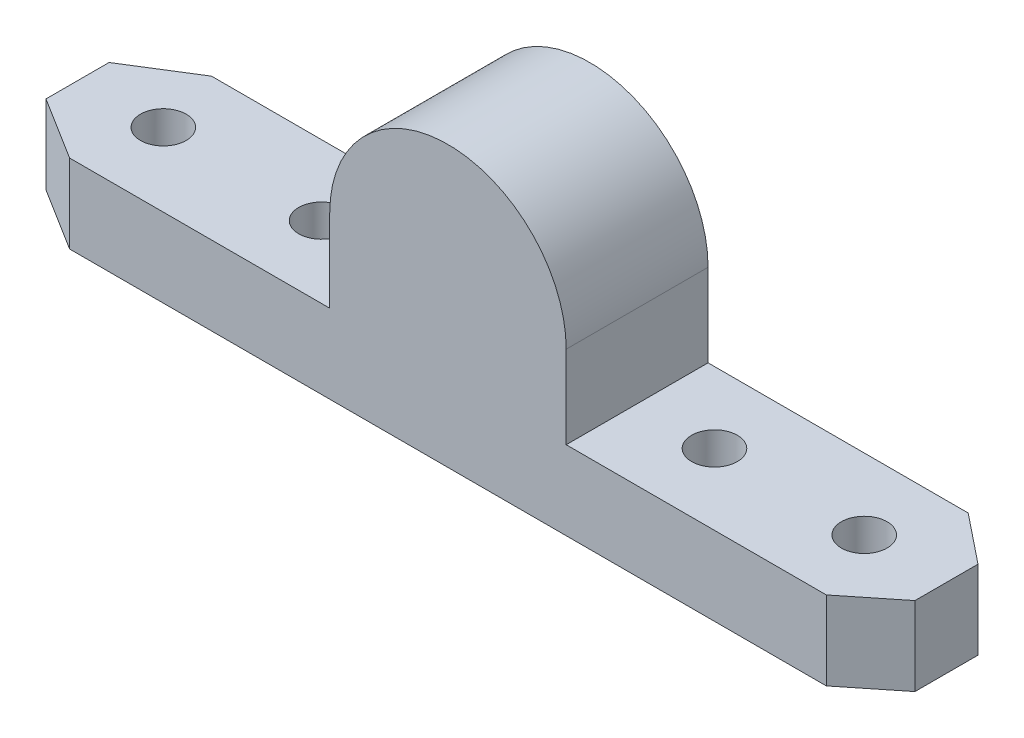
ISO-10303-21;
HEADER;
FILE_DESCRIPTION(('STEP AP214'),'2;1');
FILE_NAME('part.step','',(''),(''),'','','');
FILE_SCHEMA(('AUTOMOTIVE_DESIGN { 1 0 10303 214 1 1 1 1 }'));
ENDSEC;
DATA;
#1=APPLICATION_CONTEXT('core data for automotive mechanical design processes');
#2=APPLICATION_PROTOCOL_DEFINITION('international standard','automotive_design',2000,#1);
#3=PRODUCT_CONTEXT('',#1,'mechanical');
#4=PRODUCT('Part','Part','',(#3));
#5=PRODUCT_RELATED_PRODUCT_CATEGORY('part','',(#4));
#6=PRODUCT_DEFINITION_FORMATION('','',#4);
#7=PRODUCT_DEFINITION_CONTEXT('part definition',#1,'design');
#8=PRODUCT_DEFINITION('design','',#6,#7);
#9=PRODUCT_DEFINITION_SHAPE('','',#8);
#10=(LENGTH_UNIT() NAMED_UNIT(*) SI_UNIT(.MILLI.,.METRE.));
#11=(NAMED_UNIT(*) PLANE_ANGLE_UNIT() SI_UNIT($,.RADIAN.));
#12=(NAMED_UNIT(*) SI_UNIT($,.STERADIAN.) SOLID_ANGLE_UNIT());
#13=UNCERTAINTY_MEASURE_WITH_UNIT(LENGTH_MEASURE(1.E-05),#10,'distance_accuracy_value','');
#14=(GEOMETRIC_REPRESENTATION_CONTEXT(3) GLOBAL_UNCERTAINTY_ASSIGNED_CONTEXT((#13)) GLOBAL_UNIT_ASSIGNED_CONTEXT((#10,
#11,#12)) REPRESENTATION_CONTEXT('',''));
#15=CARTESIAN_POINT('',(0.,0.,0.));
#16=DIRECTION('',(0.,0.,1.));
#17=DIRECTION('',(1.,0.,0.));
#18=AXIS2_PLACEMENT_3D('',#15,#16,#17);
#19=CARTESIAN_POINT('',(0.,5.,0.));
#20=DIRECTION('',(0.,-1.,0.));
#21=DIRECTION('',(0.,0.,-1.));
#22=AXIS2_PLACEMENT_3D('',#19,#20,#21);
#23=PLANE('',#22);
#24=CARTESIAN_POINT('',(-22.7160462296342,5.,-0.159099942734997));
#25=DIRECTION('',(0.,1.,0.));
#26=DIRECTION('',(0.,0.,1.));
#27=AXIS2_PLACEMENT_3D('',#24,#25,#26);
#28=CIRCLE('',#27,1.45);
#29=CARTESIAN_POINT('',(-22.7160462296342,5.,1.290900057265));
#30=VERTEX_POINT('',#29);
#31=EDGE_CURVE('E283',#30,#30,#28,.T.);
#32=ORIENTED_EDGE('',*,*,#31,.F.);
#33=EDGE_LOOP('',(#32));
#34=FACE_BOUND('',#33,.T.);
#35=CARTESIAN_POINT('',(-12.5720154098781,5.,-0.0530333142449984));
#36=DIRECTION('',(0.,1.,0.));
#37=DIRECTION('',(0.,0.,1.));
#38=AXIS2_PLACEMENT_3D('',#35,#36,#37);
#39=CIRCLE('',#38,1.45);
#40=CARTESIAN_POINT('',(-12.5720154098781,5.,1.396966685755));
#41=VERTEX_POINT('',#40);
#42=EDGE_CURVE('E287',#41,#41,#39,.T.);
#43=ORIENTED_EDGE('',*,*,#42,.F.);
#44=EDGE_LOOP('',(#43));
#45=FACE_BOUND('',#44,.T.);
#46=DIRECTION('',(0.,0.,1.));
#47=VECTOR('',#46,1.);
#48=CARTESIAN_POINT('',(-7.49999999999999,5.,-4.5));
#49=LINE('',#48,#47);
#50=CARTESIAN_POINT('',(-7.49999999999999,5.,-4.5));
#51=VERTEX_POINT('',#50);
#52=CARTESIAN_POINT('',(-7.49999999999999,5.,4.5));
#53=VERTEX_POINT('',#52);
#54=EDGE_CURVE('E241',#51,#53,#49,.T.);
#55=ORIENTED_EDGE('',*,*,#54,.F.);
#56=DIRECTION('',(-1.,0.,0.));
#57=VECTOR('',#56,1.);
#58=CARTESIAN_POINT('',(-24.,5.,-4.5));
#59=LINE('',#58,#57);
#60=CARTESIAN_POINT('',(-24.,5.,-4.5));
#61=VERTEX_POINT('',#60);
#62=EDGE_CURVE('E114',#51,#61,#59,.T.);
#63=ORIENTED_EDGE('',*,*,#62,.T.);
#64=DIRECTION('',(-0.847998304005088,0.,0.52999894000318));
#65=VECTOR('',#64,1.);
#66=CARTESIAN_POINT('',(-24.,5.,-4.5));
#67=LINE('',#66,#65);
#68=CARTESIAN_POINT('',(-28.,5.,-1.99999999999999));
#69=VERTEX_POINT('',#68);
#70=EDGE_CURVE('E255',#61,#69,#67,.T.);
#71=ORIENTED_EDGE('',*,*,#70,.T.);
#72=DIRECTION('',(0.,0.,1.));
#73=VECTOR('',#72,1.);
#74=CARTESIAN_POINT('',(-28.,5.,-1.99999999999999));
#75=LINE('',#74,#73);
#76=CARTESIAN_POINT('',(-28.,5.,2.));
#77=VERTEX_POINT('',#76);
#78=EDGE_CURVE('E258',#69,#77,#75,.T.);
#79=ORIENTED_EDGE('',*,*,#78,.T.);
#80=DIRECTION('',(0.847998304005088,0.,0.529998940003179));
#81=VECTOR('',#80,1.);
#82=CARTESIAN_POINT('',(-28.,5.,2.));
#83=LINE('',#82,#81);
#84=CARTESIAN_POINT('',(-24.,5.,4.5));
#85=VERTEX_POINT('',#84);
#86=EDGE_CURVE('E261',#77,#85,#83,.T.);
#87=ORIENTED_EDGE('',*,*,#86,.T.);
#88=DIRECTION('',(1.,0.,0.));
#89=VECTOR('',#88,1.);
#90=CARTESIAN_POINT('',(-24.,5.,4.5));
#91=LINE('',#90,#89);
#92=EDGE_CURVE('E143',#85,#53,#91,.T.);
#93=ORIENTED_EDGE('',*,*,#92,.T.);
#94=EDGE_LOOP('',(#55,#63,#71,#79,#87,#93));
#95=FACE_BOUND('',#94,.T.);
#96=ADVANCED_FACE('F45',(#34,#45,#95),#23,.F.);
#97=CARTESIAN_POINT('',(-24.,5.,-4.5));
#98=DIRECTION('',(0.,0.,1.));
#99=DIRECTION('',(1.,0.,0.));
#100=AXIS2_PLACEMENT_3D('',#97,#98,#99);
#101=PLANE('',#100);
#102=DIRECTION('',(-1.,0.,0.));
#103=VECTOR('',#102,1.);
#104=CARTESIAN_POINT('',(-24.,0.,-4.5));
#105=LINE('',#104,#103);
#106=CARTESIAN_POINT('',(24.,0.,-4.5));
#107=VERTEX_POINT('',#106);
#108=CARTESIAN_POINT('',(-24.,0.,-4.5));
#109=VERTEX_POINT('',#108);
#110=EDGE_CURVE('E164',#107,#109,#105,.T.);
#111=ORIENTED_EDGE('',*,*,#110,.T.);
#112=DIRECTION('',(0.,-1.,0.));
#113=VECTOR('',#112,1.);
#114=CARTESIAN_POINT('',(-24.,5.,-4.5));
#115=LINE('',#114,#113);
#116=EDGE_CURVE('E11',#61,#109,#115,.T.);
#117=ORIENTED_EDGE('',*,*,#116,.F.);
#118=ORIENTED_EDGE('',*,*,#62,.F.);
#119=DIRECTION('',(0.,-1.,0.));
#120=VECTOR('',#119,1.);
#121=CARTESIAN_POINT('',(-7.49999999999999,5.,-4.5));
#122=LINE('',#121,#120);
#123=CARTESIAN_POINT('',(-7.49999999999999,10.25,-4.5));
#124=VERTEX_POINT('',#123);
#125=EDGE_CURVE('E232',#124,#51,#122,.T.);
#126=ORIENTED_EDGE('',*,*,#125,.F.);
#127=CARTESIAN_POINT('',(0.,10.25,-4.5));
#128=DIRECTION('',(0.,0.,1.));
#129=DIRECTION('',(-1.,0.,0.));
#130=AXIS2_PLACEMENT_3D('',#127,#128,#129);
#131=CIRCLE('',#130,7.5);
#132=CARTESIAN_POINT('',(7.50000000000001,10.25,-4.5));
#133=VERTEX_POINT('',#132);
#134=EDGE_CURVE('E271',#133,#124,#131,.T.);
#135=ORIENTED_EDGE('',*,*,#134,.F.);
#136=DIRECTION('',(0.,1.,0.));
#137=VECTOR('',#136,1.);
#138=CARTESIAN_POINT('',(7.50000000000001,10.25,-4.5));
#139=LINE('',#138,#137);
#140=CARTESIAN_POINT('',(7.50000000000001,5.,-4.5));
#141=VERTEX_POINT('',#140);
#142=EDGE_CURVE('E238',#141,#133,#139,.T.);
#143=ORIENTED_EDGE('',*,*,#142,.F.);
#144=CARTESIAN_POINT('',(24.,5.,-4.5));
#145=VERTEX_POINT('',#144);
#146=EDGE_CURVE('E252',#145,#141,#59,.T.);
#147=ORIENTED_EDGE('',*,*,#146,.F.);
#148=DIRECTION('',(0.,-1.,0.));
#149=VECTOR('',#148,1.);
#150=CARTESIAN_POINT('',(24.,5.,-4.5));
#151=LINE('',#150,#149);
#152=EDGE_CURVE('E160',#145,#107,#151,.T.);
#153=ORIENTED_EDGE('',*,*,#152,.T.);
#154=EDGE_LOOP('',(#111,#117,#118,#126,#135,#143,#147,#153));
#155=FACE_BOUND('',#154,.T.);
#156=ADVANCED_FACE('F47',(#155),#101,.F.);
#157=CARTESIAN_POINT('',(-24.,5.,-4.5));
#158=DIRECTION('',(0.52999894000318,0.,0.847998304005088));
#159=DIRECTION('',(0.847998304005088,0.,-0.52999894000318));
#160=AXIS2_PLACEMENT_3D('',#157,#158,#159);
#161=PLANE('',#160);
#162=DIRECTION('',(-0.847998304005088,0.,0.52999894000318));
#163=VECTOR('',#162,1.);
#164=CARTESIAN_POINT('',(-24.,0.,-4.5));
#165=LINE('',#164,#163);
#166=CARTESIAN_POINT('',(-28.,0.,-1.99999999999999));
#167=VERTEX_POINT('',#166);
#168=EDGE_CURVE('E168',#109,#167,#165,.T.);
#169=ORIENTED_EDGE('',*,*,#168,.T.);
#170=DIRECTION('',(0.,-1.,0.));
#171=VECTOR('',#170,1.);
#172=CARTESIAN_POINT('',(-28.,5.,-1.99999999999999));
#173=LINE('',#172,#171);
#174=EDGE_CURVE('E55',#69,#167,#173,.T.);
#175=ORIENTED_EDGE('',*,*,#174,.F.);
#176=ORIENTED_EDGE('',*,*,#70,.F.);
#177=ORIENTED_EDGE('',*,*,#116,.T.);
#178=EDGE_LOOP('',(#169,#175,#176,#177));
#179=FACE_BOUND('',#178,.T.);
#180=ADVANCED_FACE('F327',(#179),#161,.F.);
#181=CARTESIAN_POINT('',(-28.,5.,-1.99999999999999));
#182=DIRECTION('',(1.,0.,0.));
#183=DIRECTION('',(0.,0.,-1.));
#184=AXIS2_PLACEMENT_3D('',#181,#182,#183);
#185=PLANE('',#184);
#186=DIRECTION('',(0.,0.,1.));
#187=VECTOR('',#186,1.);
#188=CARTESIAN_POINT('',(-28.,0.,-1.99999999999999));
#189=LINE('',#188,#187);
#190=CARTESIAN_POINT('',(-28.,0.,2.));
#191=VERTEX_POINT('',#190);
#192=EDGE_CURVE('E172',#167,#191,#189,.T.);
#193=ORIENTED_EDGE('',*,*,#192,.T.);
#194=DIRECTION('',(0.,-1.,0.));
#195=VECTOR('',#194,1.);
#196=CARTESIAN_POINT('',(-28.,5.,2.));
#197=LINE('',#196,#195);
#198=EDGE_CURVE('E198',#77,#191,#197,.T.);
#199=ORIENTED_EDGE('',*,*,#198,.F.);
#200=ORIENTED_EDGE('',*,*,#78,.F.);
#201=ORIENTED_EDGE('',*,*,#174,.T.);
#202=EDGE_LOOP('',(#193,#199,#200,#201));
#203=FACE_BOUND('',#202,.T.);
#204=ADVANCED_FACE('F348',(#203),#185,.F.);
#205=CARTESIAN_POINT('',(-28.,5.,2.));
#206=DIRECTION('',(0.529998940003179,0.,-0.847998304005088));
#207=DIRECTION('',(-0.847998304005088,0.,-0.529998940003179));
#208=AXIS2_PLACEMENT_3D('',#205,#206,#207);
#209=PLANE('',#208);
#210=DIRECTION('',(0.847998304005088,0.,0.529998940003179));
#211=VECTOR('',#210,1.);
#212=CARTESIAN_POINT('',(-28.,0.,2.));
#213=LINE('',#212,#211);
#214=CARTESIAN_POINT('',(-24.,0.,4.5));
#215=VERTEX_POINT('',#214);
#216=EDGE_CURVE('E175',#191,#215,#213,.T.);
#217=ORIENTED_EDGE('',*,*,#216,.T.);
#218=DIRECTION('',(0.,-1.,0.));
#219=VECTOR('',#218,1.);
#220=CARTESIAN_POINT('',(-24.,5.,4.5));
#221=LINE('',#220,#219);
#222=EDGE_CURVE('E194',#85,#215,#221,.T.);
#223=ORIENTED_EDGE('',*,*,#222,.F.);
#224=ORIENTED_EDGE('',*,*,#86,.F.);
#225=ORIENTED_EDGE('',*,*,#198,.T.);
#226=EDGE_LOOP('',(#217,#223,#224,#225));
#227=FACE_BOUND('',#226,.T.);
#228=ADVANCED_FACE('F345',(#227),#209,.F.);
#229=CARTESIAN_POINT('',(-24.,5.,4.5));
#230=DIRECTION('',(0.,0.,-1.));
#231=DIRECTION('',(-1.,0.,0.));
#232=AXIS2_PLACEMENT_3D('',#229,#230,#231);
#233=PLANE('',#232);
#234=DIRECTION('',(1.,0.,0.));
#235=VECTOR('',#234,1.);
#236=CARTESIAN_POINT('',(-24.,0.,4.5));
#237=LINE('',#236,#235);
#238=CARTESIAN_POINT('',(24.,0.,4.5));
#239=VERTEX_POINT('',#238);
#240=EDGE_CURVE('E178',#215,#239,#237,.T.);
#241=ORIENTED_EDGE('',*,*,#240,.T.);
#242=DIRECTION('',(0.,-1.,0.));
#243=VECTOR('',#242,1.);
#244=CARTESIAN_POINT('',(24.,5.,4.5));
#245=LINE('',#244,#243);
#246=CARTESIAN_POINT('',(24.,5.,4.5));
#247=VERTEX_POINT('',#246);
#248=EDGE_CURVE('E153',#247,#239,#245,.T.);
#249=ORIENTED_EDGE('',*,*,#248,.F.);
#250=CARTESIAN_POINT('',(7.50000000000001,5.,4.5));
#251=VERTEX_POINT('',#250);
#252=EDGE_CURVE('E138',#251,#247,#91,.T.);
#253=ORIENTED_EDGE('',*,*,#252,.F.);
#254=DIRECTION('',(0.,1.,0.));
#255=VECTOR('',#254,1.);
#256=CARTESIAN_POINT('',(7.50000000000001,10.25,4.5));
#257=LINE('',#256,#255);
#258=CARTESIAN_POINT('',(7.50000000000001,10.25,4.5));
#259=VERTEX_POINT('',#258);
#260=EDGE_CURVE('E63',#251,#259,#257,.T.);
#261=ORIENTED_EDGE('',*,*,#260,.T.);
#262=CARTESIAN_POINT('',(0.,10.25,4.5));
#263=DIRECTION('',(0.,0.,1.));
#264=DIRECTION('',(-1.,0.,0.));
#265=AXIS2_PLACEMENT_3D('',#262,#263,#264);
#266=CIRCLE('',#265,7.5);
#267=CARTESIAN_POINT('',(-7.49999999999999,10.25,4.5));
#268=VERTEX_POINT('',#267);
#269=EDGE_CURVE('E223',#259,#268,#266,.T.);
#270=ORIENTED_EDGE('',*,*,#269,.T.);
#271=DIRECTION('',(0.,-1.,0.));
#272=VECTOR('',#271,1.);
#273=CARTESIAN_POINT('',(-7.49999999999999,5.,4.5));
#274=LINE('',#273,#272);
#275=EDGE_CURVE('E229',#268,#53,#274,.T.);
#276=ORIENTED_EDGE('',*,*,#275,.T.);
#277=ORIENTED_EDGE('',*,*,#92,.F.);
#278=ORIENTED_EDGE('',*,*,#222,.T.);
#279=EDGE_LOOP('',(#241,#249,#253,#261,#270,#276,#277,#278));
#280=FACE_BOUND('',#279,.T.);
#281=ADVANCED_FACE('F342',(#280),#233,.F.);
#282=CARTESIAN_POINT('',(27.1224989991992,5.,2.));
#283=DIRECTION('',(-0.625,0.,-0.7806247497998));
#284=DIRECTION('',(-0.7806247497998,0.,0.625));
#285=AXIS2_PLACEMENT_3D('',#282,#283,#284);
#286=PLANE('',#285);
#287=DIRECTION('',(0.7806247497998,0.,-0.625));
#288=VECTOR('',#287,1.);
#289=CARTESIAN_POINT('',(27.1224989991992,0.,2.));
#290=LINE('',#289,#288);
#291=CARTESIAN_POINT('',(27.1224989991992,0.,2.));
#292=VERTEX_POINT('',#291);
#293=EDGE_CURVE('E149',#239,#292,#290,.T.);
#294=ORIENTED_EDGE('',*,*,#293,.T.);
#295=DIRECTION('',(0.,-1.,0.));
#296=VECTOR('',#295,1.);
#297=CARTESIAN_POINT('',(27.1224989991992,5.,2.));
#298=LINE('',#297,#296);
#299=CARTESIAN_POINT('',(27.1224989991992,5.,2.));
#300=VERTEX_POINT('',#299);
#301=EDGE_CURVE('E146',#300,#292,#298,.T.);
#302=ORIENTED_EDGE('',*,*,#301,.F.);
#303=DIRECTION('',(0.7806247497998,0.,-0.625));
#304=VECTOR('',#303,1.);
#305=CARTESIAN_POINT('',(27.1224989991992,5.,2.));
#306=LINE('',#305,#304);
#307=EDGE_CURVE('E131',#247,#300,#306,.T.);
#308=ORIENTED_EDGE('',*,*,#307,.F.);
#309=ORIENTED_EDGE('',*,*,#248,.T.);
#310=EDGE_LOOP('',(#294,#302,#308,#309));
#311=FACE_BOUND('',#310,.T.);
#312=ADVANCED_FACE('F147',(#311),#286,.F.);
#313=CARTESIAN_POINT('',(27.1224989991992,5.,-2.));
#314=DIRECTION('',(-1.,0.,0.));
#315=DIRECTION('',(0.,0.,1.));
#316=AXIS2_PLACEMENT_3D('',#313,#314,#315);
#317=PLANE('',#316);
#318=DIRECTION('',(0.,0.,-1.));
#319=VECTOR('',#318,1.);
#320=CARTESIAN_POINT('',(27.1224989991992,0.,-2.));
#321=LINE('',#320,#319);
#322=CARTESIAN_POINT('',(27.1224989991992,0.,-2.));
#323=VERTEX_POINT('',#322);
#324=EDGE_CURVE('E183',#292,#323,#321,.T.);
#325=ORIENTED_EDGE('',*,*,#324,.T.);
#326=DIRECTION('',(0.,-1.,0.));
#327=VECTOR('',#326,1.);
#328=CARTESIAN_POINT('',(27.1224989991992,5.,-2.));
#329=LINE('',#328,#327);
#330=CARTESIAN_POINT('',(27.1224989991992,5.,-2.));
#331=VERTEX_POINT('',#330);
#332=EDGE_CURVE('E154',#331,#323,#329,.T.);
#333=ORIENTED_EDGE('',*,*,#332,.F.);
#334=DIRECTION('',(0.,0.,-1.));
#335=VECTOR('',#334,1.);
#336=CARTESIAN_POINT('',(27.1224989991992,5.,-2.));
#337=LINE('',#336,#335);
#338=EDGE_CURVE('E135',#300,#331,#337,.T.);
#339=ORIENTED_EDGE('',*,*,#338,.F.);
#340=ORIENTED_EDGE('',*,*,#301,.T.);
#341=EDGE_LOOP('',(#325,#333,#339,#340));
#342=FACE_BOUND('',#341,.T.);
#343=ADVANCED_FACE('F156',(#342),#317,.F.);
#344=CARTESIAN_POINT('',(24.,5.,-4.5));
#345=DIRECTION('',(-0.625,0.,0.7806247497998));
#346=DIRECTION('',(0.7806247497998,0.,0.625));
#347=AXIS2_PLACEMENT_3D('',#344,#345,#346);
#348=PLANE('',#347);
#349=DIRECTION('',(-0.7806247497998,0.,-0.625));
#350=VECTOR('',#349,1.);
#351=CARTESIAN_POINT('',(24.,0.,-4.5));
#352=LINE('',#351,#350);
#353=EDGE_CURVE('E105',#323,#107,#352,.T.);
#354=ORIENTED_EDGE('',*,*,#353,.T.);
#355=ORIENTED_EDGE('',*,*,#152,.F.);
#356=DIRECTION('',(-0.7806247497998,0.,-0.625));
#357=VECTOR('',#356,1.);
#358=CARTESIAN_POINT('',(24.,5.,-4.5));
#359=LINE('',#358,#357);
#360=EDGE_CURVE('E72',#331,#145,#359,.T.);
#361=ORIENTED_EDGE('',*,*,#360,.F.);
#362=ORIENTED_EDGE('',*,*,#332,.T.);
#363=EDGE_LOOP('',(#354,#355,#361,#362));
#364=FACE_BOUND('',#363,.T.);
#365=ADVANCED_FACE('F300',(#364),#348,.F.);
#366=CARTESIAN_POINT('',(21.9056247497998,5.,0.));
#367=DIRECTION('',(0.,1.,0.));
#368=DIRECTION('',(0.,0.,1.));
#369=AXIS2_PLACEMENT_3D('',#366,#367,#368);
#370=CIRCLE('',#369,1.45);
#371=CARTESIAN_POINT('',(21.9056247497998,5.,1.45));
#372=VERTEX_POINT('',#371);
#373=EDGE_CURVE('E282',#372,#372,#370,.T.);
#374=ORIENTED_EDGE('',*,*,#373,.F.);
#375=EDGE_LOOP('',(#374));
#376=FACE_BOUND('',#375,.T.);
#377=CARTESIAN_POINT('',(12.4056247497998,5.,0.));
#378=DIRECTION('',(0.,1.,0.));
#379=DIRECTION('',(0.,0.,1.));
#380=AXIS2_PLACEMENT_3D('',#377,#378,#379);
#381=CIRCLE('',#380,1.45);
#382=CARTESIAN_POINT('',(12.4056247497998,5.,1.45));
#383=VERTEX_POINT('',#382);
#384=EDGE_CURVE('E210',#383,#383,#381,.T.);
#385=ORIENTED_EDGE('',*,*,#384,.F.);
#386=EDGE_LOOP('',(#385));
#387=FACE_BOUND('',#386,.T.);
#388=ORIENTED_EDGE('',*,*,#146,.T.);
#389=DIRECTION('',(0.,0.,1.));
#390=VECTOR('',#389,1.);
#391=CARTESIAN_POINT('',(7.50000000000001,5.,-4.5));
#392=LINE('',#391,#390);
#393=EDGE_CURVE('E169',#141,#251,#392,.T.);
#394=ORIENTED_EDGE('',*,*,#393,.T.);
#395=ORIENTED_EDGE('',*,*,#252,.T.);
#396=ORIENTED_EDGE('',*,*,#307,.T.);
#397=ORIENTED_EDGE('',*,*,#338,.T.);
#398=ORIENTED_EDGE('',*,*,#360,.T.);
#399=EDGE_LOOP('',(#388,#394,#395,#396,#397,#398));
#400=FACE_BOUND('',#399,.T.);
#401=ADVANCED_FACE('F133',(#376,#387,#400),#23,.F.);
#402=CARTESIAN_POINT('',(0.,0.,0.));
#403=DIRECTION('',(0.,-1.,0.));
#404=DIRECTION('',(0.,0.,-1.));
#405=AXIS2_PLACEMENT_3D('',#402,#403,#404);
#406=PLANE('',#405);
#407=CARTESIAN_POINT('',(-22.7160462296342,0.,-0.159099942734997));
#408=DIRECTION('',(0.,-1.,0.));
#409=DIRECTION('',(0.,0.,-1.));
#410=AXIS2_PLACEMENT_3D('',#407,#408,#409);
#411=CIRCLE('',#410,1.45);
#412=CARTESIAN_POINT('',(-22.7160462296342,0.,-1.609099942735));
#413=VERTEX_POINT('',#412);
#414=EDGE_CURVE('E49',#413,#413,#411,.T.);
#415=ORIENTED_EDGE('',*,*,#414,.F.);
#416=EDGE_LOOP('',(#415));
#417=FACE_BOUND('',#416,.T.);
#418=CARTESIAN_POINT('',(-12.5720154098781,0.,-0.0530333142449984));
#419=DIRECTION('',(0.,-1.,0.));
#420=DIRECTION('',(0.,0.,-1.));
#421=AXIS2_PLACEMENT_3D('',#418,#419,#420);
#422=CIRCLE('',#421,1.45);
#423=CARTESIAN_POINT('',(-12.5720154098781,0.,-1.503033314245));
#424=VERTEX_POINT('',#423);
#425=EDGE_CURVE('E213',#424,#424,#422,.T.);
#426=ORIENTED_EDGE('',*,*,#425,.F.);
#427=EDGE_LOOP('',(#426));
#428=FACE_BOUND('',#427,.T.);
#429=CARTESIAN_POINT('',(21.9056247497998,0.,0.));
#430=DIRECTION('',(0.,-1.,0.));
#431=DIRECTION('',(0.,0.,-1.));
#432=AXIS2_PLACEMENT_3D('',#429,#430,#431);
#433=CIRCLE('',#432,1.45);
#434=CARTESIAN_POINT('',(21.9056247497998,0.,-1.45));
#435=VERTEX_POINT('',#434);
#436=EDGE_CURVE('E209',#435,#435,#433,.T.);
#437=ORIENTED_EDGE('',*,*,#436,.F.);
#438=EDGE_LOOP('',(#437));
#439=FACE_BOUND('',#438,.T.);
#440=CARTESIAN_POINT('',(12.4056247497998,0.,0.));
#441=DIRECTION('',(0.,-1.,0.));
#442=DIRECTION('',(0.,0.,-1.));
#443=AXIS2_PLACEMENT_3D('',#440,#441,#442);
#444=CIRCLE('',#443,1.45);
#445=CARTESIAN_POINT('',(12.4056247497998,0.,-1.45));
#446=VERTEX_POINT('',#445);
#447=EDGE_CURVE('E205',#446,#446,#444,.T.);
#448=ORIENTED_EDGE('',*,*,#447,.F.);
#449=EDGE_LOOP('',(#448));
#450=FACE_BOUND('',#449,.T.);
#451=ORIENTED_EDGE('',*,*,#110,.F.);
#452=ORIENTED_EDGE('',*,*,#353,.F.);
#453=ORIENTED_EDGE('',*,*,#324,.F.);
#454=ORIENTED_EDGE('',*,*,#293,.F.);
#455=ORIENTED_EDGE('',*,*,#240,.F.);
#456=ORIENTED_EDGE('',*,*,#216,.F.);
#457=ORIENTED_EDGE('',*,*,#192,.F.);
#458=ORIENTED_EDGE('',*,*,#168,.F.);
#459=EDGE_LOOP('',(#451,#452,#453,#454,#455,#456,#457,#458));
#460=FACE_BOUND('',#459,.T.);
#461=ADVANCED_FACE('F299',(#417,#428,#439,#450,#460),#406,.T.);
#462=CARTESIAN_POINT('',(7.50000000000001,10.25,-4.5));
#463=DIRECTION('',(1.,0.,0.));
#464=DIRECTION('',(0.,1.,0.));
#465=AXIS2_PLACEMENT_3D('',#462,#463,#464);
#466=PLANE('',#465);
#467=ORIENTED_EDGE('',*,*,#260,.F.);
#468=ORIENTED_EDGE('',*,*,#393,.F.);
#469=ORIENTED_EDGE('',*,*,#142,.T.);
#470=DIRECTION('',(0.,0.,1.));
#471=VECTOR('',#470,1.);
#472=CARTESIAN_POINT('',(7.50000000000001,10.25,-4.5));
#473=LINE('',#472,#471);
#474=EDGE_CURVE('E249',#133,#259,#473,.T.);
#475=ORIENTED_EDGE('',*,*,#474,.T.);
#476=EDGE_LOOP('',(#467,#468,#469,#475));
#477=FACE_BOUND('',#476,.T.);
#478=ADVANCED_FACE('F333',(#477),#466,.T.);
#479=CARTESIAN_POINT('',(-7.49999999999999,5.,-4.5));
#480=DIRECTION('',(-1.,0.,0.));
#481=DIRECTION('',(0.,0.,1.));
#482=AXIS2_PLACEMENT_3D('',#479,#480,#481);
#483=PLANE('',#482);
#484=ORIENTED_EDGE('',*,*,#275,.F.);
#485=DIRECTION('',(0.,0.,1.));
#486=VECTOR('',#485,1.);
#487=CARTESIAN_POINT('',(-7.49999999999999,10.25,-4.5));
#488=LINE('',#487,#486);
#489=EDGE_CURVE('E245',#124,#268,#488,.T.);
#490=ORIENTED_EDGE('',*,*,#489,.F.);
#491=ORIENTED_EDGE('',*,*,#125,.T.);
#492=ORIENTED_EDGE('',*,*,#54,.T.);
#493=EDGE_LOOP('',(#484,#490,#491,#492));
#494=FACE_BOUND('',#493,.T.);
#495=ADVANCED_FACE('F317',(#494),#483,.T.);
#496=CARTESIAN_POINT('',(0.,10.25,-4.5));
#497=DIRECTION('',(0.,0.,1.));
#498=DIRECTION('',(1.,0.,0.));
#499=AXIS2_PLACEMENT_3D('',#496,#497,#498);
#500=CYLINDRICAL_SURFACE('',#499,7.5);
#501=ORIENTED_EDGE('',*,*,#269,.F.);
#502=ORIENTED_EDGE('',*,*,#474,.F.);
#503=ORIENTED_EDGE('',*,*,#134,.T.);
#504=ORIENTED_EDGE('',*,*,#489,.T.);
#505=EDGE_LOOP('',(#501,#502,#503,#504));
#506=FACE_BOUND('',#505,.T.);
#507=ADVANCED_FACE('F306',(#506),#500,.T.);
#508=CARTESIAN_POINT('',(12.4056247497998,-1.,0.));
#509=DIRECTION('',(0.,1.,0.));
#510=DIRECTION('',(0.,0.,1.));
#511=AXIS2_PLACEMENT_3D('',#508,#509,#510);
#512=CYLINDRICAL_SURFACE('',#511,1.45);
#513=ORIENTED_EDGE('',*,*,#447,.T.);
#514=EDGE_LOOP('',(#513));
#515=FACE_BOUND('',#514,.T.);
#516=ORIENTED_EDGE('',*,*,#384,.T.);
#517=EDGE_LOOP('',(#516));
#518=FACE_BOUND('',#517,.T.);
#519=ADVANCED_FACE('F304',(#515,#518),#512,.F.);
#520=CARTESIAN_POINT('',(21.9056247497998,-1.,0.));
#521=DIRECTION('',(0.,1.,0.));
#522=DIRECTION('',(0.,0.,1.));
#523=AXIS2_PLACEMENT_3D('',#520,#521,#522);
#524=CYLINDRICAL_SURFACE('',#523,1.45);
#525=ORIENTED_EDGE('',*,*,#436,.T.);
#526=EDGE_LOOP('',(#525));
#527=FACE_BOUND('',#526,.T.);
#528=ORIENTED_EDGE('',*,*,#373,.T.);
#529=EDGE_LOOP('',(#528));
#530=FACE_BOUND('',#529,.T.);
#531=ADVANCED_FACE('F295',(#527,#530),#524,.F.);
#532=CARTESIAN_POINT('',(-12.5720154098781,-1.,-0.0530333142449984));
#533=DIRECTION('',(0.,1.,0.));
#534=DIRECTION('',(0.,0.,1.));
#535=AXIS2_PLACEMENT_3D('',#532,#533,#534);
#536=CYLINDRICAL_SURFACE('',#535,1.45);
#537=ORIENTED_EDGE('',*,*,#425,.T.);
#538=EDGE_LOOP('',(#537));
#539=FACE_BOUND('',#538,.T.);
#540=ORIENTED_EDGE('',*,*,#42,.T.);
#541=EDGE_LOOP('',(#540));
#542=FACE_BOUND('',#541,.T.);
#543=ADVANCED_FACE('F313',(#539,#542),#536,.F.);
#544=CARTESIAN_POINT('',(-22.7160462296342,-1.,-0.159099942734997));
#545=DIRECTION('',(0.,1.,0.));
#546=DIRECTION('',(0.,0.,1.));
#547=AXIS2_PLACEMENT_3D('',#544,#545,#546);
#548=CYLINDRICAL_SURFACE('',#547,1.45);
#549=ORIENTED_EDGE('',*,*,#414,.T.);
#550=EDGE_LOOP('',(#549));
#551=FACE_BOUND('',#550,.T.);
#552=ORIENTED_EDGE('',*,*,#31,.T.);
#553=EDGE_LOOP('',(#552));
#554=FACE_BOUND('',#553,.T.);
#555=ADVANCED_FACE('F414',(#551,#554),#548,.F.);
#556=CLOSED_SHELL('',(#96,#156,#180,#204,#228,#281,#312,#343,#365,#401,#461,#478,#495,#507,#519,
#531,#543,#555));
#557=MANIFOLD_SOLID_BREP('B2',#556);
#558=ADVANCED_BREP_SHAPE_REPRESENTATION('',(#18,#557),#14);
#559=SHAPE_DEFINITION_REPRESENTATION(#9,#558);
ENDSEC;
END-ISO-10303-21;
